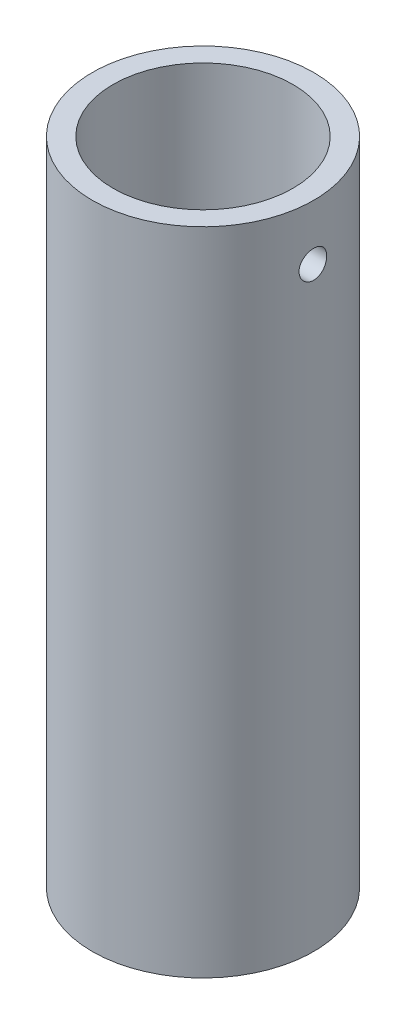
ISO-10303-21;
HEADER;
FILE_DESCRIPTION(('STEP AP214'),'2;1');
FILE_NAME('part.step','',(''),(''),'','','');
FILE_SCHEMA(('AUTOMOTIVE_DESIGN { 1 0 10303 214 1 1 1 1 }'));
ENDSEC;
DATA;
#1=APPLICATION_CONTEXT('core data for automotive mechanical design processes');
#2=APPLICATION_PROTOCOL_DEFINITION('international standard','automotive_design',2000,#1);
#3=PRODUCT_CONTEXT('',#1,'mechanical');
#4=PRODUCT('Part','Part','',(#3));
#5=PRODUCT_RELATED_PRODUCT_CATEGORY('part','',(#4));
#6=PRODUCT_DEFINITION_FORMATION('','',#4);
#7=PRODUCT_DEFINITION_CONTEXT('part definition',#1,'design');
#8=PRODUCT_DEFINITION('design','',#6,#7);
#9=PRODUCT_DEFINITION_SHAPE('','',#8);
#10=(LENGTH_UNIT() NAMED_UNIT(*) SI_UNIT(.MILLI.,.METRE.));
#11=(NAMED_UNIT(*) PLANE_ANGLE_UNIT() SI_UNIT($,.RADIAN.));
#12=(NAMED_UNIT(*) SI_UNIT($,.STERADIAN.) SOLID_ANGLE_UNIT());
#13=UNCERTAINTY_MEASURE_WITH_UNIT(LENGTH_MEASURE(1.E-05),#10,'distance_accuracy_value','');
#14=(GEOMETRIC_REPRESENTATION_CONTEXT(3) GLOBAL_UNCERTAINTY_ASSIGNED_CONTEXT((#13)) GLOBAL_UNIT_ASSIGNED_CONTEXT((#10,
#11,#12)) REPRESENTATION_CONTEXT('',''));
#15=CARTESIAN_POINT('',(0.,0.,0.));
#16=DIRECTION('',(0.,0.,1.));
#17=DIRECTION('',(1.,0.,0.));
#18=AXIS2_PLACEMENT_3D('',#15,#16,#17);
#19=CARTESIAN_POINT('',(0.,23.5,0.));
#20=DIRECTION('',(0.,1.,0.));
#21=DIRECTION('',(0.,0.,1.));
#22=AXIS2_PLACEMENT_3D('',#19,#20,#21);
#23=PLANE('',#22);
#24=CARTESIAN_POINT('',(0.,23.5,0.));
#25=DIRECTION('',(0.,1.,0.));
#26=DIRECTION('',(0.,0.,1.));
#27=AXIS2_PLACEMENT_3D('',#24,#25,#26);
#28=CIRCLE('',#27,8.);
#29=CARTESIAN_POINT('',(0.,23.5,8.));
#30=VERTEX_POINT('',#29);
#31=EDGE_CURVE('E12',#30,#30,#28,.T.);
#32=ORIENTED_EDGE('',*,*,#31,.T.);
#33=EDGE_LOOP('',(#32));
#34=FACE_BOUND('',#33,.T.);
#35=CARTESIAN_POINT('',(0.,23.5,0.));
#36=DIRECTION('',(0.,1.,0.));
#37=DIRECTION('',(1.,0.,0.));
#38=AXIS2_PLACEMENT_3D('',#35,#36,#37);
#39=CIRCLE('',#38,6.5);
#40=CARTESIAN_POINT('',(6.5,23.5,0.));
#41=VERTEX_POINT('',#40);
#42=EDGE_CURVE('E54',#41,#41,#39,.T.);
#43=ORIENTED_EDGE('',*,*,#42,.F.);
#44=EDGE_LOOP('',(#43));
#45=FACE_BOUND('',#44,.T.);
#46=ADVANCED_FACE('F42',(#34,#45),#23,.T.);
#47=CARTESIAN_POINT('',(0.,-23.5,0.));
#48=DIRECTION('',(0.,1.,0.));
#49=DIRECTION('',(0.,0.,1.));
#50=AXIS2_PLACEMENT_3D('',#47,#48,#49);
#51=PLANE('',#50);
#52=CARTESIAN_POINT('',(0.,-23.5,0.));
#53=DIRECTION('',(0.,1.,0.));
#54=DIRECTION('',(0.,0.,1.));
#55=AXIS2_PLACEMENT_3D('',#52,#53,#54);
#56=CIRCLE('',#55,8.);
#57=CARTESIAN_POINT('',(0.,-23.5,8.));
#58=VERTEX_POINT('',#57);
#59=EDGE_CURVE('E47',#58,#58,#56,.T.);
#60=ORIENTED_EDGE('',*,*,#59,.F.);
#61=EDGE_LOOP('',(#60));
#62=FACE_BOUND('',#61,.T.);
#63=CARTESIAN_POINT('',(0.,-23.5,0.));
#64=DIRECTION('',(0.,1.,0.));
#65=DIRECTION('',(1.,0.,0.));
#66=AXIS2_PLACEMENT_3D('',#63,#64,#65);
#67=CIRCLE('',#66,6.5);
#68=CARTESIAN_POINT('',(6.5,-23.5,0.));
#69=VERTEX_POINT('',#68);
#70=EDGE_CURVE('E56',#69,#69,#67,.T.);
#71=ORIENTED_EDGE('',*,*,#70,.T.);
#72=EDGE_LOOP('',(#71));
#73=FACE_BOUND('',#72,.T.);
#74=ADVANCED_FACE('F83',(#62,#73),#51,.F.);
#75=CARTESIAN_POINT('',(0.,23.5,0.));
#76=DIRECTION('',(0.,-1.,0.));
#77=DIRECTION('',(0.,0.,-1.));
#78=AXIS2_PLACEMENT_3D('',#75,#76,#77);
#79=CYLINDRICAL_SURFACE('',#78,8.);
#80=CARTESIAN_POINT('',(7.93725393319377,19.5,-0.999999999999992));
#81=CARTESIAN_POINT('',(7.93725473668531,19.4440654864833,-0.999997621933572));
#82=CARTESIAN_POINT('',(7.93785158047578,19.3880960140381,-0.995291159608506));
#83=CARTESIAN_POINT('',(7.94017356391989,19.2777147098382,-0.976590565488528));
#84=CARTESIAN_POINT('',(7.94189988257185,19.2233045678012,-0.962586728436509));
#85=CARTESIAN_POINT('',(7.94628229510171,19.1176560471536,-0.925710677130377));
#86=CARTESIAN_POINT('',(7.9489377578146,19.0664155431525,-0.90284448191929));
#87=CARTESIAN_POINT('',(7.95487849407963,18.9685086192708,-0.848905679371805));
#88=CARTESIAN_POINT('',(7.95816365993713,18.9218414193028,-0.81783447494991));
#89=CARTESIAN_POINT('',(7.9650142369756,18.8341351011512,-0.748181380105761));
#90=CARTESIAN_POINT('',(7.96858096680817,18.7931252790724,-0.709562726009713));
#91=CARTESIAN_POINT('',(7.97558093150333,18.7181508924244,-0.625990104268487));
#92=CARTESIAN_POINT('',(7.97901415971753,18.6841866783621,-0.581035821623209));
#93=CARTESIAN_POINT('',(7.98537377845129,18.6241625681975,-0.485883932270385));
#94=CARTESIAN_POINT('',(7.98829845538722,18.5981291819601,-0.435669478224443));
#95=CARTESIAN_POINT('',(7.99329694781811,18.5548755200236,-0.331538687222365));
#96=CARTESIAN_POINT('',(7.99537079489187,18.5376549172294,-0.277622487744361));
#97=CARTESIAN_POINT('',(7.99842467482491,18.5126031726662,-0.167918275100444));
#98=CARTESIAN_POINT('',(7.99941037934376,18.5047233285904,-0.112141543865351));
#99=CARTESIAN_POINT('',(8.00019627891687,18.4984258459854,-4.92802746183594E-05));
#100=CARTESIAN_POINT('',(7.99999652060831,18.500007835219,0.0562662307979086));
#101=CARTESIAN_POINT('',(7.99843859108004,18.512550081103,0.167506107589819));
#102=CARTESIAN_POINT('',(7.99708688982291,18.5234579593926,0.22243648230578));
#103=CARTESIAN_POINT('',(7.99338422376933,18.554260470652,0.329680865562148));
#104=CARTESIAN_POINT('',(7.99103323997618,18.5741552744667,0.381994824342479));
#105=CARTESIAN_POINT('',(7.98558503123165,18.6224225971135,0.482683526175453));
#106=CARTESIAN_POINT('',(7.98248581537295,18.6508177830921,0.531047291136205));
#107=CARTESIAN_POINT('',(7.97588787626113,18.7152633448864,0.622342980922587));
#108=CARTESIAN_POINT('',(7.97238913468906,18.7513140717874,0.665274656486939));
#109=CARTESIAN_POINT('',(7.96535547009406,18.8303407274394,0.744795212309172));
#110=CARTESIAN_POINT('',(7.96182046321891,18.8733623038187,0.781338735998391));
#111=CARTESIAN_POINT('',(7.95513628776232,18.964952622713,0.846693140250035));
#112=CARTESIAN_POINT('',(7.95198712039032,19.0135213826152,0.87550399657403));
#113=CARTESIAN_POINT('',(7.94643121045087,19.1148677982249,0.924577829433086));
#114=CARTESIAN_POINT('',(7.94402478363252,19.1676472319813,0.944837171944923));
#115=CARTESIAN_POINT('',(7.94023296998383,19.2758957814107,0.976192661787227));
#116=CARTESIAN_POINT('',(7.93884753394681,19.3313647673235,0.98728925071984));
#117=CARTESIAN_POINT('',(7.9372635551362,19.4430172727999,0.999944172763436));
#118=CARTESIAN_POINT('',(7.9370570697695,19.4991934492355,1.00156633679931));
#119=CARTESIAN_POINT('',(7.93783336447859,19.6110167718662,0.995394781292216));
#120=CARTESIAN_POINT('',(7.9388161192058,19.6666639293117,0.987601262443916));
#121=CARTESIAN_POINT('',(7.94185291393595,19.7756583054311,0.962873314319083));
#122=CARTESIAN_POINT('',(7.94390333077864,19.8290126460762,0.945969793498417));
#123=CARTESIAN_POINT('',(7.94884147988323,19.9321296619413,0.903533487646445));
#124=CARTESIAN_POINT('',(7.95172924156305,19.9818922108963,0.878000399432484));
#125=CARTESIAN_POINT('',(7.95803572541294,20.0767018575252,0.818872808861962));
#126=CARTESIAN_POINT('',(7.96145717094833,20.1217226661258,0.785236447830836));
#127=CARTESIAN_POINT('',(7.96843695820409,20.205502621574,0.710916296947576));
#128=CARTESIAN_POINT('',(7.97199530524515,20.2442615247472,0.670232232970187));
#129=CARTESIAN_POINT('',(7.97887235474784,20.3146416749338,0.582692710223403));
#130=CARTESIAN_POINT('',(7.98218957565009,20.346220978718,0.535803396846808));
#131=CARTESIAN_POINT('',(7.98818845212644,20.4010552870535,0.437349032672711));
#132=CARTESIAN_POINT('',(7.99087012051086,20.4243104593924,0.385784076147326));
#133=CARTESIAN_POINT('',(7.99528916261275,20.4617671147632,0.279581543655779));
#134=CARTESIAN_POINT('',(7.99702906275082,20.4759928384126,0.224952626604709));
#135=CARTESIAN_POINT('',(7.99937901871026,20.4950656356907,0.114058422911181));
#136=CARTESIAN_POINT('',(7.99998912548071,20.4999131322397,0.0577932101752405));
#137=CARTESIAN_POINT('',(8.00001051205466,20.5000839689169,-0.0543668733375149));
#138=CARTESIAN_POINT('',(7.99942993267136,20.4954719842272,-0.110261655085895));
#139=CARTESIAN_POINT('',(7.99715136463176,20.4769917546277,-0.220475096581045));
#140=CARTESIAN_POINT('',(7.99545337675258,20.4631235161553,-0.274793757423939));
#141=CARTESIAN_POINT('',(7.99112994084813,20.4265447542601,-0.380304577194924));
#142=CARTESIAN_POINT('',(7.98850481773788,20.4038373282507,-0.431497824063826));
#143=CARTESIAN_POINT('',(7.98261779042513,20.350231474157,-0.529357334857605));
#144=CARTESIAN_POINT('',(7.97935587865248,20.3193329486953,-0.576023544955208));
#145=CARTESIAN_POINT('',(7.97253277570231,20.2499827138654,-0.663834707185019));
#146=CARTESIAN_POINT('',(7.96896976511568,20.2114828825905,-0.704941515133716));
#147=CARTESIAN_POINT('',(7.96196063605416,20.1281228223884,-0.780136447527734));
#148=CARTESIAN_POINT('',(7.95851454546799,20.0832610890036,-0.814222907117391));
#149=CARTESIAN_POINT('',(7.95211524557875,19.988252030921,-0.874522097006408));
#150=CARTESIAN_POINT('',(7.94916399100913,19.938084964026,-0.900703913266687));
#151=CARTESIAN_POINT('',(7.94411143247849,19.8340573037621,-0.944234115337333));
#152=CARTESIAN_POINT('',(7.94200920461551,19.7802008002786,-0.961592108491317));
#153=CARTESIAN_POINT('',(7.93940314727937,19.6883880051826,-0.982826358495183));
#154=CARTESIAN_POINT('',(7.93860120608764,19.651010819385,-0.989257212404224));
#155=CARTESIAN_POINT('',(7.93752632891965,19.5757611000132,-0.997844822362197));
#156=CARTESIAN_POINT('',(7.93725338892971,19.5378885701996,-1.00000161083972));
#157=CARTESIAN_POINT('',(7.93725393319377,19.5,-0.999999999999992));
#158=B_SPLINE_CURVE_WITH_KNOTS('',3,(#80,#81,#82,#83,#84,#85,#86,#87,#88,#89,#90,#91,#92,#93,
#94,#95,#96,#97,#98,#99,#100,#101,#102,#103,#104,#105,#106,#107,#108,#109,#110,#111,#112,#113,
#114,#115,#116,#117,#118,#119,#120,#121,#122,#123,#124,#125,#126,#127,#128,#129,#130,#131,#132,
#133,#134,#135,#136,#137,#138,#139,#140,#141,#142,#143,#144,#145,#146,#147,#148,#149,#150,#151,
#152,#153,#154,#155,#156,#157),.UNSPECIFIED.,.T.,.F.,(4,2,2,2,2,2,2,2,2,2,2,2,2,2,2,2,2,2,2,2,2,
2,2,2,2,2,2,2,2,2,2,2,2,2,2,2,2,2,4),(0.,0.167665126991694,0.335505550460951,0.503232181032476,
0.670930151802445,0.839466310196259,1.00801085097031,1.17711274458295,1.34620836135931,
1.51441838776582,1.68262179668042,1.84988665973214,2.01715470268714,2.1848728176512,
2.3525986258764,2.52147078951106,2.69034348247768,2.85928786695601,3.02822410862473,
3.1960208712235,3.36381405730844,3.5310415051709,3.69827482884739,3.86639127817642,
4.03451426797921,4.20359554356934,4.37267341083548,4.54129542713973,4.70990983909121,
4.87737526515299,5.04484057474712,5.21224725417632,5.37965592385695,5.54816051556331,
5.71670502175928,5.88590039081929,6.05491114392802,6.16848395853175,6.28205591142185),.UNSPECIFIED.);
#159=CARTESIAN_POINT('',(7.93725393319377,19.5,-0.999999999999992));
#160=VERTEX_POINT('',#159);
#161=EDGE_CURVE('E59',#160,#160,#158,.T.);
#162=ORIENTED_EDGE('',*,*,#161,.T.);
#163=EDGE_LOOP('',(#162));
#164=FACE_BOUND('',#163,.T.);
#165=ORIENTED_EDGE('',*,*,#31,.F.);
#166=EDGE_LOOP('',(#165));
#167=FACE_BOUND('',#166,.T.);
#168=ORIENTED_EDGE('',*,*,#59,.T.);
#169=EDGE_LOOP('',(#168));
#170=FACE_BOUND('',#169,.T.);
#171=ADVANCED_FACE('F44',(#164,#167,#170),#79,.T.);
#172=CARTESIAN_POINT('',(0.,23.5,0.));
#173=DIRECTION('',(0.,-1.,0.));
#174=DIRECTION('',(0.,0.,-1.));
#175=AXIS2_PLACEMENT_3D('',#172,#173,#174);
#176=CYLINDRICAL_SURFACE('',#175,6.5);
#177=CARTESIAN_POINT('',(6.42261628933257,19.5,-0.999999999999992));
#178=CARTESIAN_POINT('',(6.42261724068016,19.444187341866,-0.999997707751986));
#179=CARTESIAN_POINT('',(6.42335168437258,19.3883427100765,-0.995311614948652));
#180=CARTESIAN_POINT('',(6.42620796135445,19.2782160310079,-0.976696735845568));
#181=CARTESIAN_POINT('',(6.42833113149643,19.2239355420667,-0.962759043334619));
#182=CARTESIAN_POINT('',(6.4337188255752,19.1185470831712,-0.926068875031412));
#183=CARTESIAN_POINT('',(6.43698245614001,19.0674366667554,-0.903323297332798));
#184=CARTESIAN_POINT('',(6.44428228220938,18.969764674134,-0.849679481292595));
#185=CARTESIAN_POINT('',(6.4483183756594,18.92320249826,-0.818782319700198));
#186=CARTESIAN_POINT('',(6.45674633408788,18.8355500168414,-0.749434774226173));
#187=CARTESIAN_POINT('',(6.46114064848277,18.7945035400952,-0.710929283129539));
#188=CARTESIAN_POINT('',(6.46976808170541,18.7194276233988,-0.62757712820682));
#189=CARTESIAN_POINT('',(6.47400119150938,18.6853985757943,-0.58273011006091));
#190=CARTESIAN_POINT('',(6.48185495401946,18.6251611268171,-0.487686425033487));
#191=CARTESIAN_POINT('',(6.4854723980919,18.5989931843555,-0.437463828075662));
#192=CARTESIAN_POINT('',(6.49166008281894,18.5554804879732,-0.333271258658496));
#193=CARTESIAN_POINT('',(6.49423038162007,18.5381352441271,-0.279301494468975));
#194=CARTESIAN_POINT('',(6.49801689011853,18.5128934482323,-0.169598317135602));
#195=CARTESIAN_POINT('',(6.49924362109567,18.504923443083,-0.113882173982097));
#196=CARTESIAN_POINT('',(6.50024085412718,18.4984302133025,-0.00189078733646506));
#197=CARTESIAN_POINT('',(6.50001144113629,18.4999064375569,0.0543844233471387));
#198=CARTESIAN_POINT('',(6.49813062413775,18.5122059471292,0.165395118376188));
#199=CARTESIAN_POINT('',(6.4964912434606,18.5229502027041,0.220139591552506));
#200=CARTESIAN_POINT('',(6.49198808780698,18.5533566465284,0.327039229039976));
#201=CARTESIAN_POINT('',(6.48912427999815,18.5730190739147,0.379194323876447));
#202=CARTESIAN_POINT('',(6.48247342417073,18.6207840965905,0.479672989997759));
#203=CARTESIAN_POINT('',(6.47868276520047,18.6489198050385,0.527980571377455));
#204=CARTESIAN_POINT('',(6.47060038338108,18.7128085261884,0.619218600239415));
#205=CARTESIAN_POINT('',(6.46630862587344,18.7485620659191,0.662148675360118));
#206=CARTESIAN_POINT('',(6.45764998101851,18.8271113706245,0.741879161682309));
#207=CARTESIAN_POINT('',(6.45328277573368,18.8699761523283,0.77861157695466));
#208=CARTESIAN_POINT('',(6.44500866845989,18.961297114447,0.844372656809218));
#209=CARTESIAN_POINT('',(6.44110176959207,19.0097533327709,0.873401269156643));
#210=CARTESIAN_POINT('',(6.43419065590172,19.1109543165861,0.922940837418679));
#211=CARTESIAN_POINT('',(6.43118721047854,19.1637026890728,0.943444538992418));
#212=CARTESIAN_POINT('',(6.42643647201367,19.2719510034501,0.975282446620121));
#213=CARTESIAN_POINT('',(6.42468908559984,19.3274507404834,0.986617334267591));
#214=CARTESIAN_POINT('',(6.4226661008499,19.4390206237402,0.999702051997398));
#215=CARTESIAN_POINT('',(6.42237568433643,19.4950791921313,1.00154839051456));
#216=CARTESIAN_POINT('',(6.42326015169089,19.606705012156,0.995859924219539));
#217=CARTESIAN_POINT('',(6.42443498764303,19.662272279796,0.988325426173751));
#218=CARTESIAN_POINT('',(6.42810395580811,19.7710374829899,0.964171112338298));
#219=CARTESIAN_POINT('',(6.43059107027018,19.824246405064,0.947599608620353));
#220=CARTESIAN_POINT('',(6.43659855031491,19.927131481542,0.90589203462006));
#221=CARTESIAN_POINT('',(6.44011896935039,19.9768074530213,0.880755521259044));
#222=CARTESIAN_POINT('',(6.44783120022147,20.0716484419006,0.822400498937804));
#223=CARTESIAN_POINT('',(6.45202810073414,20.1167746847841,0.789119656277443));
#224=CARTESIAN_POINT('',(6.46060518261195,20.2008361488566,0.71550710512029));
#225=CARTESIAN_POINT('',(6.46498537488553,20.2397710009072,0.675174976517802));
#226=CARTESIAN_POINT('',(6.47348193954584,20.3106923493317,0.588179144267437));
#227=CARTESIAN_POINT('',(6.47759565615073,20.3426147978219,0.541462929136614));
#228=CARTESIAN_POINT('',(6.48505420398133,20.3981584198062,0.443274906434845));
#229=CARTESIAN_POINT('',(6.48839905712183,20.4217798299136,0.391803234466492));
#230=CARTESIAN_POINT('',(6.49393138816185,20.4599491034653,0.285763197890026));
#231=CARTESIAN_POINT('',(6.49612328527787,20.4745316513046,0.231207558317285));
#232=CARTESIAN_POINT('',(6.49912131723634,20.4943213850505,0.120385560646834));
#233=CARTESIAN_POINT('',(6.49992754856795,20.4995292237547,0.0641193219423232));
#234=CARTESIAN_POINT('',(6.500062353657,20.500405141432,-0.0479061639139729));
#235=CARTESIAN_POINT('',(6.49940608779134,20.4961710955243,-0.103664652154724));
#236=CARTESIAN_POINT('',(6.49672029066455,20.4784936468244,-0.213666649997848));
#237=CARTESIAN_POINT('',(6.49469076448041,20.4650502780793,-0.267910165200357));
#238=CARTESIAN_POINT('',(6.48948547296008,20.4293711556712,-0.373313222450819));
#239=CARTESIAN_POINT('',(6.48631063636231,20.4071425246333,-0.42447522419929));
#240=CARTESIAN_POINT('',(6.47916296049136,20.3545344007288,-0.522358663383249));
#241=CARTESIAN_POINT('',(6.47519009262013,20.3241546157463,-0.56907994159365));
#242=CARTESIAN_POINT('',(6.46683879450388,20.2557541677317,-0.657251389701406));
#243=CARTESIAN_POINT('',(6.46245676306425,20.2176613646258,-0.698645260023514));
#244=CARTESIAN_POINT('',(6.45380727212359,20.1350679596376,-0.774488601955784));
#245=CARTESIAN_POINT('',(6.44953983973235,20.0905658571285,-0.808936442727234));
#246=CARTESIAN_POINT('',(6.44157552340405,19.996105830937,-0.870094457295084));
#247=CARTESIAN_POINT('',(6.43788217507743,19.9461171017394,-0.896757506594648));
#248=CARTESIAN_POINT('',(6.43152571710155,19.8423367583706,-0.941268750208907));
#249=CARTESIAN_POINT('',(6.42886154773017,19.7885491237319,-0.95912601690582));
#250=CARTESIAN_POINT('',(6.42547517410645,19.6954390226621,-0.981504601558668));
#251=CARTESIAN_POINT('',(6.42440883732834,19.6566892478608,-0.988429650798534));
#252=CARTESIAN_POINT('',(6.42297906472706,19.578631600874,-0.997678125268065));
#253=CARTESIAN_POINT('',(6.4226156190448,19.5393237365243,-1.00000161504145));
#254=CARTESIAN_POINT('',(6.42261628933257,19.5,-0.999999999999992));
#255=B_SPLINE_CURVE_WITH_KNOTS('',3,(#177,#178,#179,#180,#181,#182,#183,#184,#185,#186,#187,
#188,#189,#190,#191,#192,#193,#194,#195,#196,#197,#198,#199,#200,#201,#202,#203,#204,#205,#206,
#207,#208,#209,#210,#211,#212,#213,#214,#215,#216,#217,#218,#219,#220,#221,#222,#223,#224,#225,
#226,#227,#228,#229,#230,#231,#232,#233,#234,#235,#236,#237,#238,#239,#240,#241,#242,#243,#244,
#245,#246,#247,#248,#249,#250,#251,#252,#253,#254),.UNSPECIFIED.,.T.,.F.,(4,2,2,2,2,2,2,2,2,2,2,
2,2,2,2,2,2,2,2,2,2,2,2,2,2,2,2,2,2,2,2,2,2,2,2,2,2,2,4),(0.,0.167294227169444,
0.334749737015561,0.502074364686615,0.669376901370825,0.837938833108562,1.00651018662279,
1.17593482448044,1.34535005314089,1.51342891508735,1.68149797102313,1.8481478894578,
2.01480227680284,2.18211658397587,2.34944247031109,2.51849910978262,2.68755689549468,
2.85675824928792,3.02594702379379,3.19341151745715,3.36087053494272,3.52744296529171,
3.69402401394957,3.86192223873052,4.02983047006249,4.19921381335767,4.36859232815028,
4.5373168046159,4.70602953168031,4.87300151104075,5.03997287310327,5.20680914042203,
5.37365138751096,5.54213288398973,5.71065389182192,5.88017482452791,6.04952073715158,
6.16739232055718,6.28526225062674),.UNSPECIFIED.);
#256=CARTESIAN_POINT('',(6.42261628933257,19.5,-0.999999999999992));
#257=VERTEX_POINT('',#256);
#258=EDGE_CURVE('E67',#257,#257,#255,.T.);
#259=ORIENTED_EDGE('',*,*,#258,.F.);
#260=EDGE_LOOP('',(#259));
#261=FACE_BOUND('',#260,.T.);
#262=ORIENTED_EDGE('',*,*,#42,.T.);
#263=EDGE_LOOP('',(#262));
#264=FACE_BOUND('',#263,.T.);
#265=ORIENTED_EDGE('',*,*,#70,.F.);
#266=EDGE_LOOP('',(#265));
#267=FACE_BOUND('',#266,.T.);
#268=ADVANCED_FACE('F74',(#261,#264,#267),#176,.F.);
#269=CARTESIAN_POINT('',(8.,19.5,0.));
#270=DIRECTION('',(1.,0.,0.));
#271=DIRECTION('',(0.,0.,-1.));
#272=AXIS2_PLACEMENT_3D('',#269,#270,#271);
#273=CYLINDRICAL_SURFACE('',#272,0.999999999999992);
#274=ORIENTED_EDGE('',*,*,#258,.T.);
#275=EDGE_LOOP('',(#274));
#276=FACE_BOUND('',#275,.T.);
#277=ORIENTED_EDGE('',*,*,#161,.F.);
#278=EDGE_LOOP('',(#277));
#279=FACE_BOUND('',#278,.T.);
#280=ADVANCED_FACE('F71',(#276,#279),#273,.F.);
#281=CLOSED_SHELL('',(#46,#74,#171,#268,#280));
#282=MANIFOLD_SOLID_BREP('B2',#281);
#283=ADVANCED_BREP_SHAPE_REPRESENTATION('',(#18,#282),#14);
#284=SHAPE_DEFINITION_REPRESENTATION(#9,#283);
ENDSEC;
END-ISO-10303-21;
